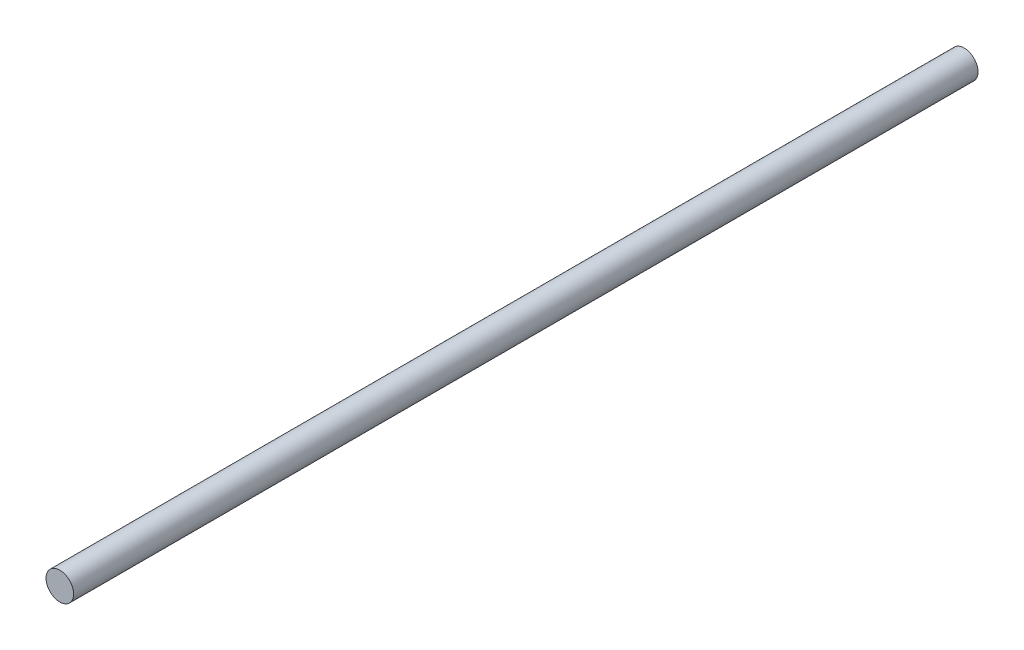
ISO-10303-21;
HEADER;
FILE_DESCRIPTION(('STEP AP214'),'2;1');
FILE_NAME('part.step','',(''),(''),'','','');
FILE_SCHEMA(('AUTOMOTIVE_DESIGN { 1 0 10303 214 1 1 1 1 }'));
ENDSEC;
DATA;
#1=APPLICATION_CONTEXT('core data for automotive mechanical design processes');
#2=APPLICATION_PROTOCOL_DEFINITION('international standard','automotive_design',2000,#1);
#3=PRODUCT_CONTEXT('',#1,'mechanical');
#4=PRODUCT('Part','Part','',(#3));
#5=PRODUCT_RELATED_PRODUCT_CATEGORY('part','',(#4));
#6=PRODUCT_DEFINITION_FORMATION('','',#4);
#7=PRODUCT_DEFINITION_CONTEXT('part definition',#1,'design');
#8=PRODUCT_DEFINITION('design','',#6,#7);
#9=PRODUCT_DEFINITION_SHAPE('','',#8);
#10=(LENGTH_UNIT() NAMED_UNIT(*) SI_UNIT(.MILLI.,.METRE.));
#11=(NAMED_UNIT(*) PLANE_ANGLE_UNIT() SI_UNIT($,.RADIAN.));
#12=(NAMED_UNIT(*) SI_UNIT($,.STERADIAN.) SOLID_ANGLE_UNIT());
#13=UNCERTAINTY_MEASURE_WITH_UNIT(LENGTH_MEASURE(1.E-05),#10,'distance_accuracy_value','');
#14=(GEOMETRIC_REPRESENTATION_CONTEXT(3) GLOBAL_UNCERTAINTY_ASSIGNED_CONTEXT((#13)) GLOBAL_UNIT_ASSIGNED_CONTEXT((#10,
#11,#12)) REPRESENTATION_CONTEXT('',''));
#15=CARTESIAN_POINT('',(0.,0.,0.));
#16=DIRECTION('',(0.,0.,1.));
#17=DIRECTION('',(1.,0.,0.));
#18=AXIS2_PLACEMENT_3D('',#15,#16,#17);
#19=CARTESIAN_POINT('',(0.,0.,415.925));
#20=DIRECTION('',(0.,0.,-1.));
#21=DIRECTION('',(-1.,0.,0.));
#22=AXIS2_PLACEMENT_3D('',#19,#20,#21);
#23=CYLINDRICAL_SURFACE('',#22,6.35);
#24=CARTESIAN_POINT('',(0.,0.,415.925));
#25=DIRECTION('',(0.,0.,1.));
#26=DIRECTION('',(1.,0.,0.));
#27=AXIS2_PLACEMENT_3D('',#24,#25,#26);
#28=CIRCLE('',#27,6.35);
#29=CARTESIAN_POINT('',(-6.35,0.,415.925));
#30=VERTEX_POINT('',#29);
#31=EDGE_CURVE('E10',#30,#30,#28,.T.);
#32=CARTESIAN_POINT('',(0.,0.,0.));
#33=DIRECTION('',(0.,0.,1.));
#34=DIRECTION('',(1.,0.,0.));
#35=AXIS2_PLACEMENT_3D('',#32,#33,#34);
#36=CIRCLE('',#35,6.35);
#37=CARTESIAN_POINT('',(-6.35,0.,0.));
#38=VERTEX_POINT('',#37);
#39=EDGE_CURVE('E34',#38,#38,#36,.T.);
#40=CARTESIAN_POINT('',(-6.35,0.,415.925));
#41=CARTESIAN_POINT('',(-6.35,0.,411.592447916667));
#42=CARTESIAN_POINT('',(-6.35,0.,407.259895833333));
#43=CARTESIAN_POINT('',(-6.35,0.,398.594791666667));
#44=CARTESIAN_POINT('',(-6.35,0.,394.262239583333));
#45=CARTESIAN_POINT('',(-6.35,0.,385.597135416667));
#46=CARTESIAN_POINT('',(-6.35,0.,381.264583333333));
#47=CARTESIAN_POINT('',(-6.35,0.,372.599479166667));
#48=CARTESIAN_POINT('',(-6.35,0.,368.266927083333));
#49=CARTESIAN_POINT('',(-6.35,0.,359.601822916667));
#50=CARTESIAN_POINT('',(-6.35,0.,355.269270833333));
#51=CARTESIAN_POINT('',(-6.35,0.,346.604166666667));
#52=CARTESIAN_POINT('',(-6.35,0.,342.271614583333));
#53=CARTESIAN_POINT('',(-6.35,0.,333.606510416667));
#54=CARTESIAN_POINT('',(-6.35,0.,329.273958333333));
#55=CARTESIAN_POINT('',(-6.35,0.,320.608854166667));
#56=CARTESIAN_POINT('',(-6.35,0.,316.276302083333));
#57=CARTESIAN_POINT('',(-6.35,0.,307.611197916667));
#58=CARTESIAN_POINT('',(-6.35,0.,303.278645833333));
#59=CARTESIAN_POINT('',(-6.35,0.,294.613541666667));
#60=CARTESIAN_POINT('',(-6.35,0.,290.280989583333));
#61=CARTESIAN_POINT('',(-6.35,0.,281.615885416667));
#62=CARTESIAN_POINT('',(-6.35,0.,277.283333333333));
#63=CARTESIAN_POINT('',(-6.35,0.,268.618229166667));
#64=CARTESIAN_POINT('',(-6.35,0.,264.285677083333));
#65=CARTESIAN_POINT('',(-6.35,0.,255.620572916667));
#66=CARTESIAN_POINT('',(-6.35,0.,251.288020833333));
#67=CARTESIAN_POINT('',(-6.35,0.,242.622916666667));
#68=CARTESIAN_POINT('',(-6.35,0.,238.290364583333));
#69=CARTESIAN_POINT('',(-6.35,0.,229.625260416667));
#70=CARTESIAN_POINT('',(-6.35,0.,225.292708333333));
#71=CARTESIAN_POINT('',(-6.35,0.,216.627604166667));
#72=CARTESIAN_POINT('',(-6.35,0.,212.295052083333));
#73=CARTESIAN_POINT('',(-6.35,0.,203.629947916667));
#74=CARTESIAN_POINT('',(-6.35,0.,199.297395833333));
#75=CARTESIAN_POINT('',(-6.35,0.,190.632291666667));
#76=CARTESIAN_POINT('',(-6.35,0.,186.299739583333));
#77=CARTESIAN_POINT('',(-6.35,0.,177.634635416667));
#78=CARTESIAN_POINT('',(-6.35,0.,173.302083333333));
#79=CARTESIAN_POINT('',(-6.35,0.,164.636979166667));
#80=CARTESIAN_POINT('',(-6.35,0.,160.304427083333));
#81=CARTESIAN_POINT('',(-6.35,0.,151.639322916667));
#82=CARTESIAN_POINT('',(-6.35,0.,147.306770833333));
#83=CARTESIAN_POINT('',(-6.35,0.,138.641666666667));
#84=CARTESIAN_POINT('',(-6.35,0.,134.309114583333));
#85=CARTESIAN_POINT('',(-6.35,0.,125.644010416667));
#86=CARTESIAN_POINT('',(-6.35,0.,121.311458333333));
#87=CARTESIAN_POINT('',(-6.35,0.,112.646354166667));
#88=CARTESIAN_POINT('',(-6.35,0.,108.313802083333));
#89=CARTESIAN_POINT('',(-6.35,0.,99.6486979166666));
#90=CARTESIAN_POINT('',(-6.35,0.,95.3161458333333));
#91=CARTESIAN_POINT('',(-6.35,0.,86.6510416666667));
#92=CARTESIAN_POINT('',(-6.35,0.,82.3184895833333));
#93=CARTESIAN_POINT('',(-6.35,0.,73.6533854166667));
#94=CARTESIAN_POINT('',(-6.35,0.,69.3208333333333));
#95=CARTESIAN_POINT('',(-6.35,0.,60.6557291666666));
#96=CARTESIAN_POINT('',(-6.35,0.,56.3231770833333));
#97=CARTESIAN_POINT('',(-6.35,0.,47.6580729166666));
#98=CARTESIAN_POINT('',(-6.35,0.,43.3255208333333));
#99=CARTESIAN_POINT('',(-6.35,0.,34.6604166666666));
#100=CARTESIAN_POINT('',(-6.35,0.,30.3278645833333));
#101=CARTESIAN_POINT('',(-6.35,0.,21.6627604166666));
#102=CARTESIAN_POINT('',(-6.35,0.,17.3302083333333));
#103=CARTESIAN_POINT('',(-6.35,0.,8.66510416666661));
#104=CARTESIAN_POINT('',(-6.35,0.,4.33255208333328));
#105=CARTESIAN_POINT('',(-6.35,0.,0.));
#106=B_SPLINE_CURVE_WITH_KNOTS('',3,(#40,#41,#42,#43,#44,#45,#46,#47,#48,#49,#50,#51,#52,#53,
#54,#55,#56,#57,#58,#59,#60,#61,#62,#63,#64,#65,#66,#67,#68,#69,#70,#71,#72,#73,#74,#75,#76,#77,
#78,#79,#80,#81,#82,#83,#84,#85,#86,#87,#88,#89,#90,#91,#92,#93,#94,#95,#96,#97,#98,#99,#100,
#101,#102,#103,#104,#105),.UNSPECIFIED.,.F.,.F.,(4,2,2,2,2,2,2,2,2,2,2,2,2,2,2,2,2,2,2,2,2,2,2,
2,2,2,2,2,2,2,2,2,4),(0.,12.99765625,25.9953125,38.99296875,51.990625,64.98828125,77.9859375,
90.98359375,103.98125,116.97890625,129.9765625,142.97421875,155.971875,168.96953125,181.9671875,
194.96484375,207.9625,220.96015625,233.9578125,246.95546875,259.953125,272.95078125,285.9484375,
298.94609375,311.94375,324.94140625,337.9390625,350.93671875,363.934375,376.93203125,
389.9296875,402.92734375,415.925),.UNSPECIFIED.);
#107=EDGE_CURVE('BSEAM31',#30,#38,#106,.T.);
#108=ORIENTED_EDGE('',*,*,#31,.F.);
#109=ORIENTED_EDGE('',*,*,#39,.T.);
#110=ORIENTED_EDGE('',*,*,#107,.T.);
#111=ORIENTED_EDGE('',*,*,#107,.F.);
#112=EDGE_LOOP('',(#108,#110,#109,#111));
#113=FACE_BOUND('',#112,.T.);
#114=ADVANCED_FACE('F31',(#113),#23,.T.);
#115=CARTESIAN_POINT('',(0.,0.,415.925));
#116=DIRECTION('',(0.,0.,1.));
#117=DIRECTION('',(1.,0.,0.));
#118=AXIS2_PLACEMENT_3D('',#115,#116,#117);
#119=PLANE('',#118);
#120=ORIENTED_EDGE('',*,*,#31,.T.);
#121=EDGE_LOOP('',(#120));
#122=FACE_BOUND('',#121,.T.);
#123=ADVANCED_FACE('F46',(#122),#119,.T.);
#124=CARTESIAN_POINT('',(0.,0.,0.));
#125=DIRECTION('',(0.,0.,1.));
#126=DIRECTION('',(1.,0.,0.));
#127=AXIS2_PLACEMENT_3D('',#124,#125,#126);
#128=PLANE('',#127);
#129=ORIENTED_EDGE('',*,*,#39,.F.);
#130=EDGE_LOOP('',(#129));
#131=FACE_BOUND('',#130,.T.);
#132=ADVANCED_FACE('F44',(#131),#128,.F.);
#133=CLOSED_SHELL('',(#114,#123,#132));
#134=MANIFOLD_SOLID_BREP('B2',#133);
#135=ADVANCED_BREP_SHAPE_REPRESENTATION('',(#18,#134),#14);
#136=SHAPE_DEFINITION_REPRESENTATION(#9,#135);
ENDSEC;
END-ISO-10303-21;
